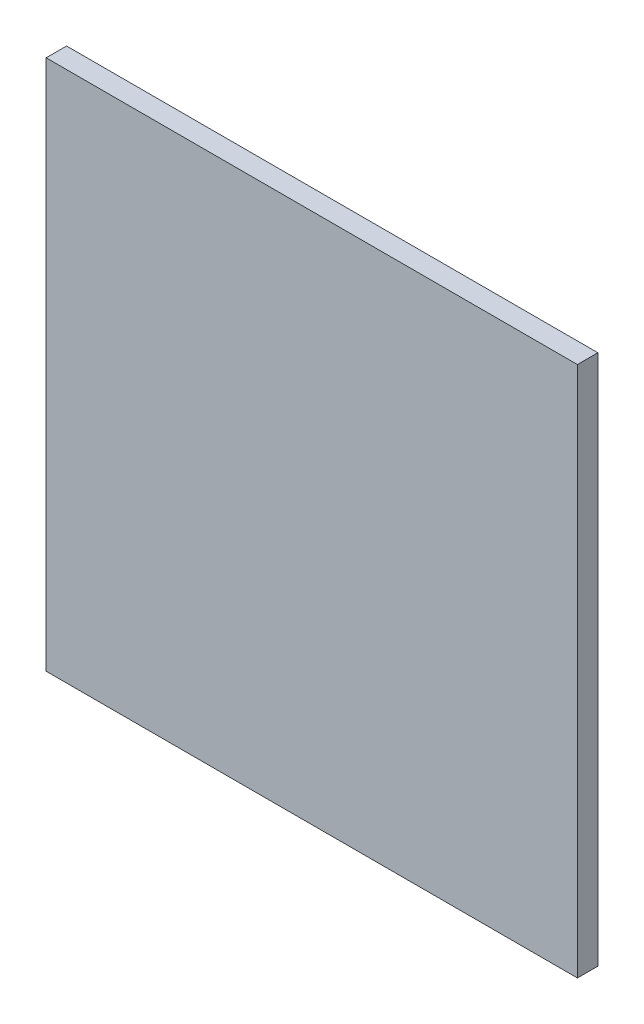
ISO-10303-21;
HEADER;
FILE_DESCRIPTION(('STEP AP214'),'2;1');
FILE_NAME('part.step','',(''),(''),'','','');
FILE_SCHEMA(('AUTOMOTIVE_DESIGN { 1 0 10303 214 1 1 1 1 }'));
ENDSEC;
DATA;
#1=APPLICATION_CONTEXT('core data for automotive mechanical design processes');
#2=APPLICATION_PROTOCOL_DEFINITION('international standard','automotive_design',2000,#1);
#3=PRODUCT_CONTEXT('',#1,'mechanical');
#4=PRODUCT('Part','Part','',(#3));
#5=PRODUCT_RELATED_PRODUCT_CATEGORY('part','',(#4));
#6=PRODUCT_DEFINITION_FORMATION('','',#4);
#7=PRODUCT_DEFINITION_CONTEXT('part definition',#1,'design');
#8=PRODUCT_DEFINITION('design','',#6,#7);
#9=PRODUCT_DEFINITION_SHAPE('','',#8);
#10=(LENGTH_UNIT() NAMED_UNIT(*) SI_UNIT(.MILLI.,.METRE.));
#11=(NAMED_UNIT(*) PLANE_ANGLE_UNIT() SI_UNIT($,.RADIAN.));
#12=(NAMED_UNIT(*) SI_UNIT($,.STERADIAN.) SOLID_ANGLE_UNIT());
#13=UNCERTAINTY_MEASURE_WITH_UNIT(LENGTH_MEASURE(1.E-05),#10,'distance_accuracy_value','');
#14=(GEOMETRIC_REPRESENTATION_CONTEXT(3) GLOBAL_UNCERTAINTY_ASSIGNED_CONTEXT((#13)) GLOBAL_UNIT_ASSIGNED_CONTEXT((#10,
#11,#12)) REPRESENTATION_CONTEXT('',''));
#15=CARTESIAN_POINT('',(0.,0.,0.));
#16=DIRECTION('',(0.,0.,1.));
#17=DIRECTION('',(1.,0.,0.));
#18=AXIS2_PLACEMENT_3D('',#15,#16,#17);
#19=CARTESIAN_POINT('',(0.,0.,0.05));
#20=DIRECTION('',(0.,0.,1.));
#21=DIRECTION('',(1.,0.,0.));
#22=AXIS2_PLACEMENT_3D('',#19,#20,#21);
#23=PLANE('',#22);
#24=DIRECTION('',(0.,1.,0.));
#25=VECTOR('',#24,1.);
#26=CARTESIAN_POINT('',(1.3,0.,0.05));
#27=LINE('',#26,#25);
#28=CARTESIAN_POINT('',(1.3,1.3,0.05));
#29=VERTEX_POINT('',#28);
#30=CARTESIAN_POINT('',(1.3,0.,0.05));
#31=VERTEX_POINT('',#30);
#32=EDGE_CURVE('E76',#29,#31,#27,.F.);
#33=ORIENTED_EDGE('',*,*,#32,.F.);
#34=DIRECTION('',(1.,0.,0.));
#35=VECTOR('',#34,1.);
#36=CARTESIAN_POINT('',(0.,1.3,0.05));
#37=LINE('',#36,#35);
#38=CARTESIAN_POINT('',(0.,1.3,0.05));
#39=VERTEX_POINT('',#38);
#40=EDGE_CURVE('E58',#39,#29,#37,.T.);
#41=ORIENTED_EDGE('',*,*,#40,.F.);
#42=DIRECTION('',(0.,1.,0.));
#43=VECTOR('',#42,1.);
#44=CARTESIAN_POINT('',(0.,0.,0.05));
#45=LINE('',#44,#43);
#46=CARTESIAN_POINT('',(0.,0.,0.05));
#47=VERTEX_POINT('',#46);
#48=EDGE_CURVE('E20',#39,#47,#45,.F.);
#49=ORIENTED_EDGE('',*,*,#48,.T.);
#50=DIRECTION('',(1.,0.,0.));
#51=VECTOR('',#50,1.);
#52=CARTESIAN_POINT('',(0.,0.,0.05));
#53=LINE('',#52,#51);
#54=EDGE_CURVE('E55',#47,#31,#53,.T.);
#55=ORIENTED_EDGE('',*,*,#54,.T.);
#56=EDGE_LOOP('',(#33,#41,#49,#55));
#57=FACE_BOUND('',#56,.T.);
#58=ADVANCED_FACE('F17',(#57),#23,.T.);
#59=CARTESIAN_POINT('',(0.,0.,0.));
#60=DIRECTION('',(1.,0.,0.));
#61=DIRECTION('',(0.,0.,-1.));
#62=AXIS2_PLACEMENT_3D('',#59,#60,#61);
#63=PLANE('',#62);
#64=DIRECTION('',(0.,0.,1.));
#65=VECTOR('',#64,1.);
#66=CARTESIAN_POINT('',(0.,1.3,0.));
#67=LINE('',#66,#65);
#68=CARTESIAN_POINT('',(0.,1.3,0.));
#69=VERTEX_POINT('',#68);
#70=EDGE_CURVE('E78',#69,#39,#67,.T.);
#71=ORIENTED_EDGE('',*,*,#70,.F.);
#72=DIRECTION('',(0.,1.,0.));
#73=VECTOR('',#72,1.);
#74=CARTESIAN_POINT('',(0.,0.,0.));
#75=LINE('',#74,#73);
#76=CARTESIAN_POINT('',(0.,0.,0.));
#77=VERTEX_POINT('',#76);
#78=EDGE_CURVE('E73',#69,#77,#75,.F.);
#79=ORIENTED_EDGE('',*,*,#78,.T.);
#80=DIRECTION('',(0.,0.,1.));
#81=VECTOR('',#80,1.);
#82=CARTESIAN_POINT('',(0.,0.,0.));
#83=LINE('',#82,#81);
#84=EDGE_CURVE('E63',#77,#47,#83,.T.);
#85=ORIENTED_EDGE('',*,*,#84,.T.);
#86=ORIENTED_EDGE('',*,*,#48,.F.);
#87=EDGE_LOOP('',(#71,#79,#85,#86));
#88=FACE_BOUND('',#87,.T.);
#89=ADVANCED_FACE('F72',(#88),#63,.F.);
#90=CARTESIAN_POINT('',(0.,0.,0.));
#91=DIRECTION('',(0.,1.,0.));
#92=DIRECTION('',(0.,0.,1.));
#93=AXIS2_PLACEMENT_3D('',#90,#91,#92);
#94=PLANE('',#93);
#95=ORIENTED_EDGE('',*,*,#54,.F.);
#96=ORIENTED_EDGE('',*,*,#84,.F.);
#97=DIRECTION('',(1.,0.,0.));
#98=VECTOR('',#97,1.);
#99=CARTESIAN_POINT('',(0.,0.,0.));
#100=LINE('',#99,#98);
#101=CARTESIAN_POINT('',(1.3,0.,0.));
#102=VERTEX_POINT('',#101);
#103=EDGE_CURVE('E83',#77,#102,#100,.T.);
#104=ORIENTED_EDGE('',*,*,#103,.T.);
#105=DIRECTION('',(0.,0.,-1.));
#106=VECTOR('',#105,1.);
#107=CARTESIAN_POINT('',(1.3,0.,0.));
#108=LINE('',#107,#106);
#109=EDGE_CURVE('E69',#31,#102,#108,.T.);
#110=ORIENTED_EDGE('',*,*,#109,.F.);
#111=EDGE_LOOP('',(#95,#96,#104,#110));
#112=FACE_BOUND('',#111,.T.);
#113=ADVANCED_FACE('F66',(#112),#94,.F.);
#114=CARTESIAN_POINT('',(1.3,0.,0.));
#115=DIRECTION('',(1.,0.,0.));
#116=DIRECTION('',(0.,0.,-1.));
#117=AXIS2_PLACEMENT_3D('',#114,#115,#116);
#118=PLANE('',#117);
#119=DIRECTION('',(0.,0.,1.));
#120=VECTOR('',#119,1.);
#121=CARTESIAN_POINT('',(1.3,1.3,0.));
#122=LINE('',#121,#120);
#123=CARTESIAN_POINT('',(1.3,1.3,0.));
#124=VERTEX_POINT('',#123);
#125=EDGE_CURVE('E34',#29,#124,#122,.F.);
#126=ORIENTED_EDGE('',*,*,#125,.F.);
#127=ORIENTED_EDGE('',*,*,#32,.T.);
#128=ORIENTED_EDGE('',*,*,#109,.T.);
#129=DIRECTION('',(0.,1.,0.));
#130=VECTOR('',#129,1.);
#131=CARTESIAN_POINT('',(1.3,0.,0.));
#132=LINE('',#131,#130);
#133=EDGE_CURVE('E26',#102,#124,#132,.T.);
#134=ORIENTED_EDGE('',*,*,#133,.T.);
#135=EDGE_LOOP('',(#126,#127,#128,#134));
#136=FACE_BOUND('',#135,.T.);
#137=ADVANCED_FACE('F88',(#136),#118,.T.);
#138=CARTESIAN_POINT('',(0.,1.3,0.));
#139=DIRECTION('',(0.,1.,0.));
#140=DIRECTION('',(0.,0.,1.));
#141=AXIS2_PLACEMENT_3D('',#138,#139,#140);
#142=PLANE('',#141);
#143=ORIENTED_EDGE('',*,*,#40,.T.);
#144=ORIENTED_EDGE('',*,*,#125,.T.);
#145=DIRECTION('',(1.,0.,0.));
#146=VECTOR('',#145,1.);
#147=CARTESIAN_POINT('',(0.,1.3,0.));
#148=LINE('',#147,#146);
#149=EDGE_CURVE('E11',#124,#69,#148,.F.);
#150=ORIENTED_EDGE('',*,*,#149,.T.);
#151=ORIENTED_EDGE('',*,*,#70,.T.);
#152=EDGE_LOOP('',(#143,#144,#150,#151));
#153=FACE_BOUND('',#152,.T.);
#154=ADVANCED_FACE('F91',(#153),#142,.T.);
#155=CARTESIAN_POINT('',(0.,0.,0.));
#156=DIRECTION('',(0.,0.,1.));
#157=DIRECTION('',(1.,0.,0.));
#158=AXIS2_PLACEMENT_3D('',#155,#156,#157);
#159=PLANE('',#158);
#160=ORIENTED_EDGE('',*,*,#133,.F.);
#161=ORIENTED_EDGE('',*,*,#103,.F.);
#162=ORIENTED_EDGE('',*,*,#78,.F.);
#163=ORIENTED_EDGE('',*,*,#149,.F.);
#164=EDGE_LOOP('',(#160,#161,#162,#163));
#165=FACE_BOUND('',#164,.T.);
#166=ADVANCED_FACE('F90',(#165),#159,.F.);
#167=CLOSED_SHELL('',(#58,#89,#113,#137,#154,#166));
#168=MANIFOLD_SOLID_BREP('B1',#167);
#169=ADVANCED_BREP_SHAPE_REPRESENTATION('',(#18,#168),#14);
#170=SHAPE_DEFINITION_REPRESENTATION(#9,#169);
ENDSEC;
END-ISO-10303-21;
